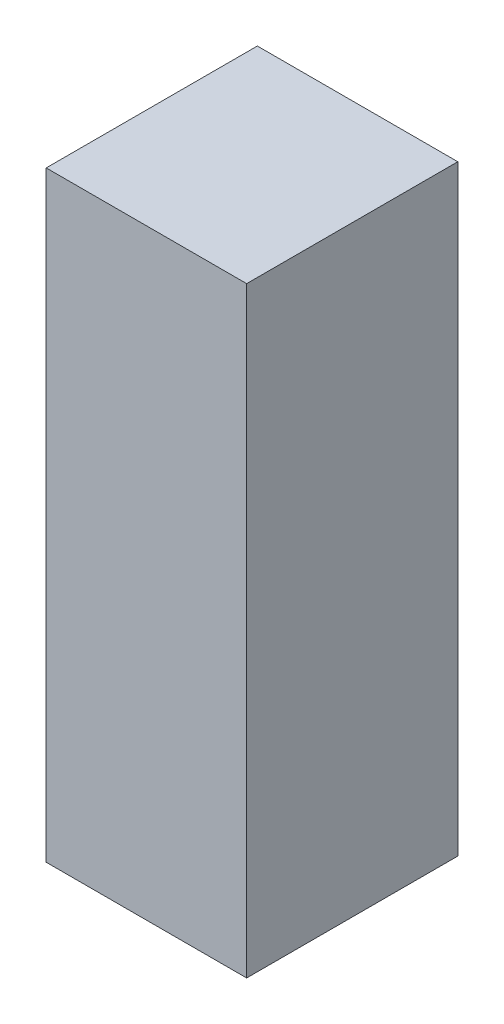
ISO-10303-21;
HEADER;
FILE_DESCRIPTION(('STEP AP214'),'2;1');
FILE_NAME('part.step','',(''),(''),'','','');
FILE_SCHEMA(('AUTOMOTIVE_DESIGN { 1 0 10303 214 1 1 1 1 }'));
ENDSEC;
DATA;
#1=APPLICATION_CONTEXT('core data for automotive mechanical design processes');
#2=APPLICATION_PROTOCOL_DEFINITION('international standard','automotive_design',2000,#1);
#3=PRODUCT_CONTEXT('',#1,'mechanical');
#4=PRODUCT('Part','Part','',(#3));
#5=PRODUCT_RELATED_PRODUCT_CATEGORY('part','',(#4));
#6=PRODUCT_DEFINITION_FORMATION('','',#4);
#7=PRODUCT_DEFINITION_CONTEXT('part definition',#1,'design');
#8=PRODUCT_DEFINITION('design','',#6,#7);
#9=PRODUCT_DEFINITION_SHAPE('','',#8);
#10=(LENGTH_UNIT() NAMED_UNIT(*) SI_UNIT(.MILLI.,.METRE.));
#11=(NAMED_UNIT(*) PLANE_ANGLE_UNIT() SI_UNIT($,.RADIAN.));
#12=(NAMED_UNIT(*) SI_UNIT($,.STERADIAN.) SOLID_ANGLE_UNIT());
#13=UNCERTAINTY_MEASURE_WITH_UNIT(LENGTH_MEASURE(1.E-05),#10,'distance_accuracy_value','');
#14=(GEOMETRIC_REPRESENTATION_CONTEXT(3) GLOBAL_UNCERTAINTY_ASSIGNED_CONTEXT((#13)) GLOBAL_UNIT_ASSIGNED_CONTEXT((#10,
#11,#12)) REPRESENTATION_CONTEXT('',''));
#15=CARTESIAN_POINT('',(0.,0.,0.));
#16=DIRECTION('',(0.,0.,1.));
#17=DIRECTION('',(1.,0.,0.));
#18=AXIS2_PLACEMENT_3D('',#15,#16,#17);
#19=CARTESIAN_POINT('',(3.,0.,0.));
#20=DIRECTION('',(0.,0.,-1.));
#21=DIRECTION('',(0.,1.,0.));
#22=AXIS2_PLACEMENT_3D('',#19,#20,#21);
#23=PLANE('',#22);
#24=DIRECTION('',(0.,-1.,0.));
#25=VECTOR('',#24,1.);
#26=CARTESIAN_POINT('',(0.,0.,0.));
#27=LINE('',#26,#25);
#28=CARTESIAN_POINT('',(0.,9.,0.));
#29=VERTEX_POINT('',#28);
#30=CARTESIAN_POINT('',(0.,0.,0.));
#31=VERTEX_POINT('',#30);
#32=EDGE_CURVE('E96',#29,#31,#27,.T.);
#33=ORIENTED_EDGE('',*,*,#32,.T.);
#34=DIRECTION('',(-1.,0.,0.));
#35=VECTOR('',#34,1.);
#36=CARTESIAN_POINT('',(3.,0.,0.));
#37=LINE('',#36,#35);
#38=CARTESIAN_POINT('',(3.,0.,0.));
#39=VERTEX_POINT('',#38);
#40=EDGE_CURVE('E11',#39,#31,#37,.T.);
#41=ORIENTED_EDGE('',*,*,#40,.F.);
#42=DIRECTION('',(0.,-1.,0.));
#43=VECTOR('',#42,1.);
#44=CARTESIAN_POINT('',(3.,0.,0.));
#45=LINE('',#44,#43);
#46=CARTESIAN_POINT('',(3.,9.,0.));
#47=VERTEX_POINT('',#46);
#48=EDGE_CURVE('E84',#47,#39,#45,.T.);
#49=ORIENTED_EDGE('',*,*,#48,.F.);
#50=DIRECTION('',(-1.,0.,0.));
#51=VECTOR('',#50,1.);
#52=CARTESIAN_POINT('',(3.,9.,0.));
#53=LINE('',#52,#51);
#54=EDGE_CURVE('E92',#47,#29,#53,.T.);
#55=ORIENTED_EDGE('',*,*,#54,.T.);
#56=EDGE_LOOP('',(#33,#41,#49,#55));
#57=FACE_BOUND('',#56,.T.);
#58=ADVANCED_FACE('F33',(#57),#23,.F.);
#59=CARTESIAN_POINT('',(3.,0.,0.));
#60=DIRECTION('',(0.,1.,0.));
#61=DIRECTION('',(0.,0.,1.));
#62=AXIS2_PLACEMENT_3D('',#59,#60,#61);
#63=PLANE('',#62);
#64=DIRECTION('',(0.,0.,-1.));
#65=VECTOR('',#64,1.);
#66=CARTESIAN_POINT('',(0.,0.,0.));
#67=LINE('',#66,#65);
#68=CARTESIAN_POINT('',(0.,0.,-3.16));
#69=VERTEX_POINT('',#68);
#70=EDGE_CURVE('E88',#31,#69,#67,.T.);
#71=ORIENTED_EDGE('',*,*,#70,.T.);
#72=DIRECTION('',(-1.,0.,0.));
#73=VECTOR('',#72,1.);
#74=CARTESIAN_POINT('',(3.,0.,-3.16));
#75=LINE('',#74,#73);
#76=CARTESIAN_POINT('',(3.,0.,-3.16));
#77=VERTEX_POINT('',#76);
#78=EDGE_CURVE('E41',#77,#69,#75,.T.);
#79=ORIENTED_EDGE('',*,*,#78,.F.);
#80=DIRECTION('',(0.,0.,-1.));
#81=VECTOR('',#80,1.);
#82=CARTESIAN_POINT('',(3.,0.,0.));
#83=LINE('',#82,#81);
#84=EDGE_CURVE('E79',#39,#77,#83,.T.);
#85=ORIENTED_EDGE('',*,*,#84,.F.);
#86=ORIENTED_EDGE('',*,*,#40,.T.);
#87=EDGE_LOOP('',(#71,#79,#85,#86));
#88=FACE_BOUND('',#87,.T.);
#89=ADVANCED_FACE('F87',(#88),#63,.F.);
#90=CARTESIAN_POINT('',(3.,0.,-3.16));
#91=DIRECTION('',(0.,0.,1.));
#92=DIRECTION('',(0.,-1.,0.));
#93=AXIS2_PLACEMENT_3D('',#90,#91,#92);
#94=PLANE('',#93);
#95=DIRECTION('',(0.,1.,0.));
#96=VECTOR('',#95,1.);
#97=CARTESIAN_POINT('',(0.,0.,-3.16));
#98=LINE('',#97,#96);
#99=CARTESIAN_POINT('',(0.,9.,-3.16));
#100=VERTEX_POINT('',#99);
#101=EDGE_CURVE('E66',#69,#100,#98,.T.);
#102=ORIENTED_EDGE('',*,*,#101,.T.);
#103=DIRECTION('',(-1.,0.,0.));
#104=VECTOR('',#103,1.);
#105=CARTESIAN_POINT('',(3.,9.,-3.16));
#106=LINE('',#105,#104);
#107=CARTESIAN_POINT('',(3.,9.,-3.16));
#108=VERTEX_POINT('',#107);
#109=EDGE_CURVE('E89',#108,#100,#106,.T.);
#110=ORIENTED_EDGE('',*,*,#109,.F.);
#111=DIRECTION('',(0.,1.,0.));
#112=VECTOR('',#111,1.);
#113=CARTESIAN_POINT('',(3.,0.,-3.16));
#114=LINE('',#113,#112);
#115=EDGE_CURVE('E82',#77,#108,#114,.T.);
#116=ORIENTED_EDGE('',*,*,#115,.F.);
#117=ORIENTED_EDGE('',*,*,#78,.T.);
#118=EDGE_LOOP('',(#102,#110,#116,#117));
#119=FACE_BOUND('',#118,.T.);
#120=ADVANCED_FACE('F90',(#119),#94,.F.);
#121=CARTESIAN_POINT('',(3.,9.,0.));
#122=DIRECTION('',(0.,-1.,0.));
#123=DIRECTION('',(0.,0.,-1.));
#124=AXIS2_PLACEMENT_3D('',#121,#122,#123);
#125=PLANE('',#124);
#126=DIRECTION('',(0.,0.,1.));
#127=VECTOR('',#126,1.);
#128=CARTESIAN_POINT('',(0.,9.,0.));
#129=LINE('',#128,#127);
#130=EDGE_CURVE('E72',#100,#29,#129,.T.);
#131=ORIENTED_EDGE('',*,*,#130,.T.);
#132=ORIENTED_EDGE('',*,*,#54,.F.);
#133=DIRECTION('',(0.,0.,1.));
#134=VECTOR('',#133,1.);
#135=CARTESIAN_POINT('',(3.,9.,0.));
#136=LINE('',#135,#134);
#137=EDGE_CURVE('E49',#108,#47,#136,.T.);
#138=ORIENTED_EDGE('',*,*,#137,.F.);
#139=ORIENTED_EDGE('',*,*,#109,.T.);
#140=EDGE_LOOP('',(#131,#132,#138,#139));
#141=FACE_BOUND('',#140,.T.);
#142=ADVANCED_FACE('F103',(#141),#125,.F.);
#143=CARTESIAN_POINT('',(3.,0.,0.));
#144=DIRECTION('',(-1.,0.,0.));
#145=DIRECTION('',(0.,0.,1.));
#146=AXIS2_PLACEMENT_3D('',#143,#144,#145);
#147=PLANE('',#146);
#148=ORIENTED_EDGE('',*,*,#48,.T.);
#149=ORIENTED_EDGE('',*,*,#84,.T.);
#150=ORIENTED_EDGE('',*,*,#115,.T.);
#151=ORIENTED_EDGE('',*,*,#137,.T.);
#152=EDGE_LOOP('',(#148,#149,#150,#151));
#153=FACE_BOUND('',#152,.T.);
#154=ADVANCED_FACE('F80',(#153),#147,.F.);
#155=CARTESIAN_POINT('',(0.,0.,0.));
#156=DIRECTION('',(-1.,0.,0.));
#157=DIRECTION('',(0.,0.,1.));
#158=AXIS2_PLACEMENT_3D('',#155,#156,#157);
#159=PLANE('',#158);
#160=ORIENTED_EDGE('',*,*,#32,.F.);
#161=ORIENTED_EDGE('',*,*,#130,.F.);
#162=ORIENTED_EDGE('',*,*,#101,.F.);
#163=ORIENTED_EDGE('',*,*,#70,.F.);
#164=EDGE_LOOP('',(#160,#161,#162,#163));
#165=FACE_BOUND('',#164,.T.);
#166=ADVANCED_FACE('F106',(#165),#159,.T.);
#167=CLOSED_SHELL('',(#58,#89,#120,#142,#154,#166));
#168=MANIFOLD_SOLID_BREP('B2',#167);
#169=ADVANCED_BREP_SHAPE_REPRESENTATION('',(#18,#168),#14);
#170=SHAPE_DEFINITION_REPRESENTATION(#9,#169);
ENDSEC;
END-ISO-10303-21;
